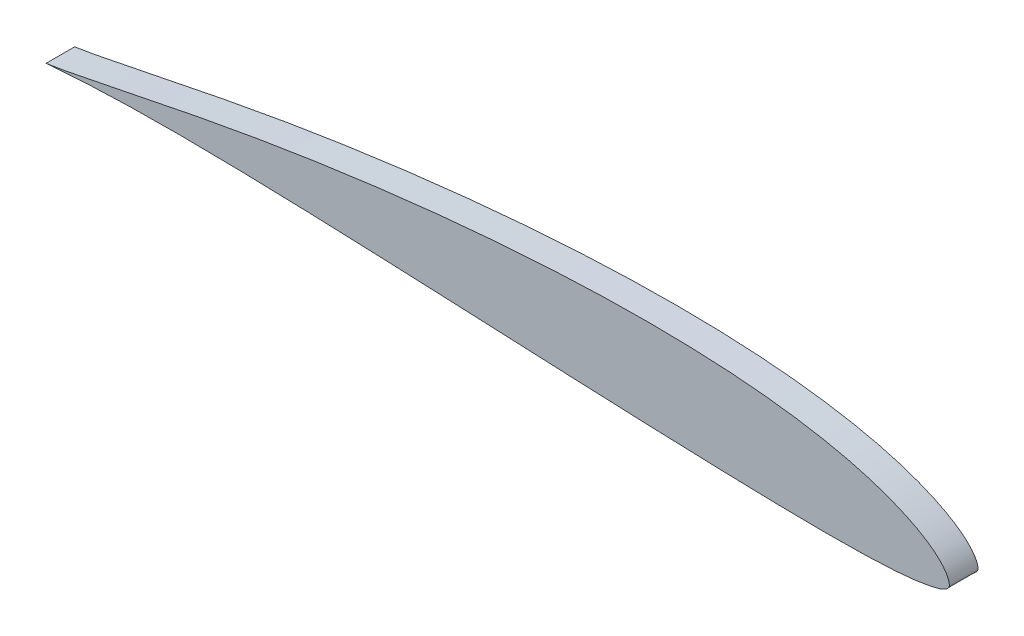
ISO-10303-21;
HEADER;
FILE_DESCRIPTION(('STEP AP214'),'2;1');
FILE_NAME('part.step','',(''),(''),'','','');
FILE_SCHEMA(('AUTOMOTIVE_DESIGN { 1 0 10303 214 1 1 1 1 }'));
ENDSEC;
DATA;
#1=APPLICATION_CONTEXT('core data for automotive mechanical design processes');
#2=APPLICATION_PROTOCOL_DEFINITION('international standard','automotive_design',2000,#1);
#3=PRODUCT_CONTEXT('',#1,'mechanical');
#4=PRODUCT('Part','Part','',(#3));
#5=PRODUCT_RELATED_PRODUCT_CATEGORY('part','',(#4));
#6=PRODUCT_DEFINITION_FORMATION('','',#4);
#7=PRODUCT_DEFINITION_CONTEXT('part definition',#1,'design');
#8=PRODUCT_DEFINITION('design','',#6,#7);
#9=PRODUCT_DEFINITION_SHAPE('','',#8);
#10=(LENGTH_UNIT() NAMED_UNIT(*) SI_UNIT(.MILLI.,.METRE.));
#11=(NAMED_UNIT(*) PLANE_ANGLE_UNIT() SI_UNIT($,.RADIAN.));
#12=(NAMED_UNIT(*) SI_UNIT($,.STERADIAN.) SOLID_ANGLE_UNIT());
#13=UNCERTAINTY_MEASURE_WITH_UNIT(LENGTH_MEASURE(1.E-05),#10,'distance_accuracy_value','');
#14=(GEOMETRIC_REPRESENTATION_CONTEXT(3) GLOBAL_UNCERTAINTY_ASSIGNED_CONTEXT((#13)) GLOBAL_UNIT_ASSIGNED_CONTEXT((#10,
#11,#12)) REPRESENTATION_CONTEXT('',''));
#15=CARTESIAN_POINT('',(0.,0.,0.));
#16=DIRECTION('',(0.,0.,1.));
#17=DIRECTION('',(1.,0.,0.));
#18=AXIS2_PLACEMENT_3D('',#15,#16,#17);
#19=CARTESIAN_POINT('',(2.3575779570362,55.8360552784786,6.35));
#20=DIRECTION('',(-0.0421856308777922,-0.999109790036832,0.));
#21=DIRECTION('',(0.999109790036832,-0.0421856308777922,0.));
#22=AXIS2_PLACEMENT_3D('',#19,#20,#21);
#23=PLANE('',#22);
#24=CARTESIAN_POINT('',(1754.97498737325,-18.165092384081,0.));
#25=DIRECTION('',(-0.0421856308777922,-0.999109790036832,0.));
#26=DIRECTION('',(0.999109790036832,-0.0421856308777922,0.));
#27=AXIS2_PLACEMENT_3D('',#24,#25,#26);
#28=ELLIPSE('',#27,3.17538763875182,3.17499999999999);
#29=CARTESIAN_POINT('',(1758.14754825028,-18.2990481149033,0.));
#30=VERTEX_POINT('',#29);
#31=EDGE_CURVE('E46',#30,#30,#28,.T.);
#32=ORIENTED_EDGE('',*,*,#31,.F.);
#33=EDGE_LOOP('',(#32));
#34=FACE_BOUND('',#33,.T.);
#35=DIRECTION('',(-0.999109790036832,0.0421856308777922,0.));
#36=VECTOR('',#35,1.);
#37=CARTESIAN_POINT('',(2.3575779570362,55.8360552784786,-6.35));
#38=LINE('',#37,#36);
#39=CARTESIAN_POINT('',(1767.6652308814,-18.7009153073702,-6.35));
#40=VERTEX_POINT('',#39);
#41=CARTESIAN_POINT('',(1742.28784221446,-17.6294002830741,-6.35));
#42=VERTEX_POINT('',#41);
#43=EDGE_CURVE('E151',#40,#42,#38,.T.);
#44=ORIENTED_EDGE('',*,*,#43,.F.);
#45=DIRECTION('',(0.,0.,-1.));
#46=VECTOR('',#45,1.);
#47=CARTESIAN_POINT('',(1767.6652308814,-18.7009153073702,6.35));
#48=LINE('',#47,#46);
#49=CARTESIAN_POINT('',(1767.6652308814,-18.7009153073702,6.35));
#50=VERTEX_POINT('',#49);
#51=EDGE_CURVE('E11',#50,#40,#48,.T.);
#52=ORIENTED_EDGE('',*,*,#51,.F.);
#53=DIRECTION('',(-0.999109790036832,0.0421856308777922,0.));
#54=VECTOR('',#53,1.);
#55=CARTESIAN_POINT('',(2.3575779570362,55.8360552784786,6.35));
#56=LINE('',#55,#54);
#57=CARTESIAN_POINT('',(1742.28784221446,-17.6294002830741,6.35));
#58=VERTEX_POINT('',#57);
#59=EDGE_CURVE('E112',#50,#58,#56,.T.);
#60=ORIENTED_EDGE('',*,*,#59,.T.);
#61=DIRECTION('',(0.,0.,-1.));
#62=VECTOR('',#61,1.);
#63=CARTESIAN_POINT('',(1742.28784221446,-17.6294002830741,6.35));
#64=LINE('',#63,#62);
#65=EDGE_CURVE('E83',#58,#42,#64,.T.);
#66=ORIENTED_EDGE('',*,*,#65,.T.);
#67=EDGE_LOOP('',(#44,#52,#60,#66));
#68=FACE_BOUND('',#67,.T.);
#69=ADVANCED_FACE('F43',(#34,#68),#23,.T.);
#70=CARTESIAN_POINT('',(1596.31021413288,-17.478209275154,6.35));
#71=CARTESIAN_POINT('',(1596.3102515309,-17.4900798795625,6.35));
#72=CARTESIAN_POINT('',(1599.1322423313,-17.2022330923903,6.35));
#73=CARTESIAN_POINT('',(1602.03182260984,-16.9907136810287,6.35));
#74=CARTESIAN_POINT('',(1609.10720109062,-16.4816305190965,6.35));
#75=CARTESIAN_POINT('',(1617.84346830049,-16.0122581327614,6.35));
#76=CARTESIAN_POINT('',(1629.29972086853,-15.5760026593076,6.35));
#77=CARTESIAN_POINT('',(1642.81673493414,-15.3091150572676,6.35));
#78=CARTESIAN_POINT('',(1658.33448053557,-15.2864051468592,6.35));
#79=CARTESIAN_POINT('',(1675.53154740055,-15.4897580032224,6.35));
#80=CARTESIAN_POINT('',(1694.16050142952,-15.9168759779006,6.35));
#81=CARTESIAN_POINT('',(1713.95156909246,-16.5363404784246,6.35));
#82=CARTESIAN_POINT('',(1734.64638447524,-17.3145316205594,6.35));
#83=CARTESIAN_POINT('',(1755.98575421537,-18.1841042418055,6.35));
#84=CARTESIAN_POINT('',(1777.70838338736,-19.1419446781197,6.35));
#85=CARTESIAN_POINT('',(1799.55769772036,-20.1293541585242,6.35));
#86=CARTESIAN_POINT('',(1821.2831429715,-21.1012838048597,6.35));
#87=CARTESIAN_POINT('',(1842.64516709738,-22.0116275533366,6.35));
#88=CARTESIAN_POINT('',(1863.40548202887,-22.8529134431896,6.35));
#89=CARTESIAN_POINT('',(1883.33023430574,-23.5822681473132,6.35));
#90=CARTESIAN_POINT('',(1902.18807730714,-24.1899386424968,6.35));
#91=CARTESIAN_POINT('',(1919.75949569216,-24.6424497284501,6.35));
#92=CARTESIAN_POINT('',(1935.8518352752,-24.8793410332257,6.35));
#93=CARTESIAN_POINT('',(1950.29422526534,-24.8739135013043,6.35));
#94=CARTESIAN_POINT('',(1962.94157873014,-24.6070759190933,6.35));
#95=CARTESIAN_POINT('',(1973.68021727723,-24.0183120574947,6.35));
#96=CARTESIAN_POINT('',(1982.39869388507,-23.1985552094744,6.35));
#97=CARTESIAN_POINT('',(1989.09296287627,-21.9114816071557,6.35));
#98=CARTESIAN_POINT('',(1993.57350987807,-20.7570563820821,6.35));
#99=CARTESIAN_POINT('',(1996.6806748032,-18.4574056102938,6.35));
#100=CARTESIAN_POINT('',(1995.81152486995,-15.0236569753175,6.35));
#101=CARTESIAN_POINT('',(1993.77484340238,-11.7907350557363,6.35));
#102=CARTESIAN_POINT('',(1990.03603736107,-8.11350883684481,6.35));
#103=CARTESIAN_POINT('',(1984.73373764165,-4.43183126644344,6.35));
#104=CARTESIAN_POINT('',(1977.84455466072,-0.738000891407876,6.35));
#105=CARTESIAN_POINT('',(1969.41765671903,2.8082946719217,6.35));
#106=CARTESIAN_POINT('',(1959.49253908317,6.11304090342494,6.35));
#107=CARTESIAN_POINT('',(1948.10296055372,9.02941444658797,6.35));
#108=CARTESIAN_POINT('',(1935.32435887673,11.5243026466393,6.35));
#109=CARTESIAN_POINT('',(1921.24125431776,13.586927955176,6.35));
#110=CARTESIAN_POINT('',(1905.94807917216,15.1257003058072,6.35));
#111=CARTESIAN_POINT('',(1889.56068995788,16.1513180356543,6.35));
#112=CARTESIAN_POINT('',(1872.20952379832,16.6653210663825,6.35));
#113=CARTESIAN_POINT('',(1854.04601062752,16.6739586592146,6.35));
#114=CARTESIAN_POINT('',(1835.23493639232,16.1998909506919,6.35));
#115=CARTESIAN_POINT('',(1815.95077146485,15.2635327555171,6.35));
#116=CARTESIAN_POINT('',(1796.37573706149,13.9033351938215,6.35));
#117=CARTESIAN_POINT('',(1776.70299506491,12.1582992439741,6.35));
#118=CARTESIAN_POINT('',(1757.13134712081,10.0744625588622,6.35));
#119=CARTESIAN_POINT('',(1737.85939642865,7.71225563047655,6.35));
#120=CARTESIAN_POINT('',(1719.08684801041,5.11473875154889,6.35));
#121=CARTESIAN_POINT('',(1701.00473801196,2.34073982283165,6.35));
#122=CARTESIAN_POINT('',(1683.79671044662,-0.560040691334636,6.35));
#123=CARTESIAN_POINT('',(1667.62831922199,-3.51396391232352,6.35));
#124=CARTESIAN_POINT('',(1652.66782034166,-6.42930574927058,6.35));
#125=CARTESIAN_POINT('',(1639.06708513807,-9.19163881630794,6.35));
#126=CARTESIAN_POINT('',(1627.05920043915,-11.6691543312357,6.35));
#127=CARTESIAN_POINT('',(1616.68795805122,-13.7848214634737,6.35));
#128=CARTESIAN_POINT('',(1608.59256465579,-15.3932547451612,6.35));
#129=CARTESIAN_POINT('',(1601.88092298677,-16.5823188951291,6.35));
#130=CARTESIAN_POINT('',(1599.08053019508,-17.0906211344314,6.35));
#131=CARTESIAN_POINT('',(1596.31017694321,-17.466404802761,6.35));
#132=CARTESIAN_POINT('',(1596.31021413288,-17.478209275154,6.35));
#133=B_SPLINE_CURVE_WITH_KNOTS('',3,(#70,#71,#72,#73,#74,#75,#76,#77,#78,#79,#80,#81,#82,#83,
#84,#85,#86,#87,#88,#89,#90,#91,#92,#93,#94,#95,#96,#97,#98,#99,#100,#101,#102,#103,#104,#105,
#106,#107,#108,#109,#110,#111,#112,#113,#114,#115,#116,#117,#118,#119,#120,#121,#122,#123,#124,
#125,#126,#127,#128,#129,#130,#131,#132),.UNSPECIFIED.,.T.,.F.,(4,1,1,1,1,1,1,1,1,1,1,1,1,1,1,1,
1,1,1,1,1,1,1,1,1,1,1,1,1,1,1,1,1,1,1,1,1,1,1,1,1,1,1,1,1,1,1,1,1,1,1,1,1,1,1,1,1,1,1,1,4),(0.,
0.00162827255922005,0.00649050965473852,0.0145193836673184,0.0256267718050507,
0.0396659782037578,0.0564158680126472,0.0755751983771271,0.0968144767188099,0.119812493963671,
0.1442464295869,0.169791911279109,0.196137839472828,0.222959252874957,0.249929689016993,
0.276747064878309,0.303109783270562,0.328732166600227,0.353323186514224,0.376592645275716,
0.398269788623994,0.418104249413604,0.435907310477593,0.451493631474574,0.464728190365783,
0.47551563303222,0.483813435244795,0.489622354181594,0.493000170515783,0.496319033276272,
0.50112136018567,0.507407277714504,0.515327375532837,0.52490812765617,0.536144750255862,
0.548990967810824,0.563425422459707,0.57944589810611,0.596955554448896,0.615864818248053,
0.636077717109341,0.657458391249912,0.679831384800272,0.703012205861105,0.726802900260427,
0.750982325596448,0.77532642647073,0.799588584319813,0.823519224580182,0.846883028826477,
0.869432574938011,0.890938901752127,0.911197778131604,0.930003617124546,0.947123678392186,
0.962312644452633,0.975299445140062,0.985817342446044,0.993591880191323,0.99838079866768,1.),.UNSPECIFIED.);
#134=DIRECTION('',(0.,0.,-1.));
#135=VECTOR('',#134,1.);
#136=SURFACE_OF_LINEAR_EXTRUSION('',#133,#135);
#137=CARTESIAN_POINT('',(1596.31021413288,-17.478209275154,-6.35));
#138=CARTESIAN_POINT('',(1596.3102515309,-17.4900798795625,-6.35));
#139=CARTESIAN_POINT('',(1599.1322423313,-17.2022330923903,-6.35));
#140=CARTESIAN_POINT('',(1602.03182260984,-16.9907136810287,-6.35));
#141=CARTESIAN_POINT('',(1609.10720109062,-16.4816305190965,-6.35));
#142=CARTESIAN_POINT('',(1617.84346830049,-16.0122581327614,-6.35));
#143=CARTESIAN_POINT('',(1629.29972086853,-15.5760026593076,-6.35));
#144=CARTESIAN_POINT('',(1642.81673493414,-15.3091150572676,-6.35));
#145=CARTESIAN_POINT('',(1658.33448053557,-15.2864051468592,-6.35));
#146=CARTESIAN_POINT('',(1675.53154740055,-15.4897580032224,-6.35));
#147=CARTESIAN_POINT('',(1694.16050142952,-15.9168759779006,-6.35));
#148=CARTESIAN_POINT('',(1713.95156909246,-16.5363404784246,-6.35));
#149=CARTESIAN_POINT('',(1734.64638447524,-17.3145316205594,-6.35));
#150=CARTESIAN_POINT('',(1755.98575421537,-18.1841042418055,-6.35));
#151=CARTESIAN_POINT('',(1777.70838338736,-19.1419446781197,-6.35));
#152=CARTESIAN_POINT('',(1799.55769772036,-20.1293541585242,-6.35));
#153=CARTESIAN_POINT('',(1821.2831429715,-21.1012838048597,-6.35));
#154=CARTESIAN_POINT('',(1842.64516709738,-22.0116275533366,-6.35));
#155=CARTESIAN_POINT('',(1863.40548202887,-22.8529134431896,-6.35));
#156=CARTESIAN_POINT('',(1883.33023430574,-23.5822681473132,-6.35));
#157=CARTESIAN_POINT('',(1902.18807730714,-24.1899386424968,-6.35));
#158=CARTESIAN_POINT('',(1919.75949569216,-24.6424497284501,-6.35));
#159=CARTESIAN_POINT('',(1935.8518352752,-24.8793410332257,-6.35));
#160=CARTESIAN_POINT('',(1950.29422526534,-24.8739135013043,-6.35));
#161=CARTESIAN_POINT('',(1962.94157873014,-24.6070759190933,-6.35));
#162=CARTESIAN_POINT('',(1973.68021727723,-24.0183120574947,-6.35));
#163=CARTESIAN_POINT('',(1982.39869388507,-23.1985552094744,-6.35));
#164=CARTESIAN_POINT('',(1989.09296287627,-21.9114816071557,-6.35));
#165=CARTESIAN_POINT('',(1993.57350987807,-20.7570563820821,-6.35));
#166=CARTESIAN_POINT('',(1996.6806748032,-18.4574056102938,-6.35));
#167=CARTESIAN_POINT('',(1995.81152486995,-15.0236569753175,-6.35));
#168=CARTESIAN_POINT('',(1993.77484340238,-11.7907350557363,-6.35));
#169=CARTESIAN_POINT('',(1990.03603736107,-8.11350883684481,-6.35));
#170=CARTESIAN_POINT('',(1984.73373764165,-4.43183126644344,-6.35));
#171=CARTESIAN_POINT('',(1977.84455466072,-0.738000891407876,-6.35));
#172=CARTESIAN_POINT('',(1969.41765671903,2.8082946719217,-6.35));
#173=CARTESIAN_POINT('',(1959.49253908317,6.11304090342494,-6.35));
#174=CARTESIAN_POINT('',(1948.10296055372,9.02941444658797,-6.35));
#175=CARTESIAN_POINT('',(1935.32435887673,11.5243026466393,-6.35));
#176=CARTESIAN_POINT('',(1921.24125431776,13.586927955176,-6.35));
#177=CARTESIAN_POINT('',(1905.94807917216,15.1257003058072,-6.35));
#178=CARTESIAN_POINT('',(1889.56068995788,16.1513180356543,-6.35));
#179=CARTESIAN_POINT('',(1872.20952379832,16.6653210663825,-6.35));
#180=CARTESIAN_POINT('',(1854.04601062752,16.6739586592146,-6.35));
#181=CARTESIAN_POINT('',(1835.23493639232,16.1998909506919,-6.35));
#182=CARTESIAN_POINT('',(1815.95077146485,15.2635327555171,-6.35));
#183=CARTESIAN_POINT('',(1796.37573706149,13.9033351938215,-6.35));
#184=CARTESIAN_POINT('',(1776.70299506491,12.1582992439741,-6.35));
#185=CARTESIAN_POINT('',(1757.13134712081,10.0744625588622,-6.35));
#186=CARTESIAN_POINT('',(1737.85939642865,7.71225563047655,-6.35));
#187=CARTESIAN_POINT('',(1719.08684801041,5.11473875154889,-6.35));
#188=CARTESIAN_POINT('',(1701.00473801196,2.34073982283165,-6.35));
#189=CARTESIAN_POINT('',(1683.79671044662,-0.560040691334636,-6.35));
#190=CARTESIAN_POINT('',(1667.62831922199,-3.51396391232352,-6.35));
#191=CARTESIAN_POINT('',(1652.66782034166,-6.42930574927058,-6.35));
#192=CARTESIAN_POINT('',(1639.06708513807,-9.19163881630794,-6.35));
#193=CARTESIAN_POINT('',(1627.05920043915,-11.6691543312357,-6.35));
#194=CARTESIAN_POINT('',(1616.68795805122,-13.7848214634737,-6.35));
#195=CARTESIAN_POINT('',(1608.59256465579,-15.3932547451612,-6.35));
#196=CARTESIAN_POINT('',(1601.88092298677,-16.5823188951291,-6.35));
#197=CARTESIAN_POINT('',(1599.08053019508,-17.0906211344314,-6.35));
#198=CARTESIAN_POINT('',(1596.31017694321,-17.466404802761,-6.35));
#199=CARTESIAN_POINT('',(1596.31021413288,-17.478209275154,-6.35));
#200=B_SPLINE_CURVE_WITH_KNOTS('',3,(#137,#138,#139,#140,#141,#142,#143,#144,#145,#146,#147,
#148,#149,#150,#151,#152,#153,#154,#155,#156,#157,#158,#159,#160,#161,#162,#163,#164,#165,#166,
#167,#168,#169,#170,#171,#172,#173,#174,#175,#176,#177,#178,#179,#180,#181,#182,#183,#184,#185,
#186,#187,#188,#189,#190,#191,#192,#193,#194,#195,#196,#197,#198,#199),.UNSPECIFIED.,.T.,.F.,(4,
1,1,1,1,1,1,1,1,1,1,1,1,1,1,1,1,1,1,1,1,1,1,1,1,1,1,1,1,1,1,1,1,1,1,1,1,1,1,1,1,1,1,1,1,1,1,1,1,
1,1,1,1,1,1,1,1,1,1,1,4),(0.,0.00162827255922005,0.00649050965473852,0.0145193836673184,
0.0256267718050507,0.0396659782037578,0.0564158680126472,0.0755751983771271,0.0968144767188099,
0.119812493963671,0.1442464295869,0.169791911279109,0.196137839472828,0.222959252874957,
0.249929689016993,0.276747064878309,0.303109783270562,0.328732166600227,0.353323186514224,
0.376592645275716,0.398269788623994,0.418104249413604,0.435907310477593,0.451493631474574,
0.464728190365783,0.47551563303222,0.483813435244795,0.489622354181594,0.493000170515783,
0.496319033276272,0.50112136018567,0.507407277714504,0.515327375532837,0.52490812765617,
0.536144750255862,0.548990967810824,0.563425422459707,0.57944589810611,0.596955554448896,
0.615864818248053,0.636077717109341,0.657458391249912,0.679831384800272,0.703012205861105,
0.726802900260427,0.750982325596448,0.77532642647073,0.799588584319813,0.823519224580182,
0.846883028826477,0.869432574938011,0.890938901752127,0.911197778131604,0.930003617124546,
0.947123678392186,0.962312644452633,0.975299445140062,0.985817342446044,0.993591880191323,
0.99838079866768,1.),.UNSPECIFIED.);
#201=CARTESIAN_POINT('',(1894.67419788151,-23.9426877498647,-6.35));
#202=VERTEX_POINT('',#201);
#203=EDGE_CURVE('E154',#40,#202,#200,.T.);
#204=ORIENTED_EDGE('',*,*,#203,.T.);
#205=DIRECTION('',(0.,0.,-1.));
#206=VECTOR('',#205,1.);
#207=CARTESIAN_POINT('',(1894.67419788151,-23.9426877498647,6.35));
#208=LINE('',#207,#206);
#209=CARTESIAN_POINT('',(1894.67419788151,-23.9426877498647,6.35));
#210=VERTEX_POINT('',#209);
#211=EDGE_CURVE('E52',#210,#202,#208,.T.);
#212=ORIENTED_EDGE('',*,*,#211,.F.);
#213=EDGE_CURVE('E114',#50,#210,#133,.T.);
#214=ORIENTED_EDGE('',*,*,#213,.F.);
#215=ORIENTED_EDGE('',*,*,#51,.T.);
#216=EDGE_LOOP('',(#204,#212,#214,#215));
#217=FACE_BOUND('',#216,.T.);
#218=ADVANCED_FACE('F131',(#217),#136,.F.);
#219=CARTESIAN_POINT('',(0.701602531150922,26.3969899564991,6.35));
#220=DIRECTION('',(-0.0265695007087187,-0.999646968500425,0.));
#221=DIRECTION('',(0.999646968500425,-0.0265695007087187,0.));
#222=AXIS2_PLACEMENT_3D('',#219,#220,#221);
#223=PLANE('',#222);
#224=CARTESIAN_POINT('',(1907.36971438147,-24.2801204088655,0.));
#225=DIRECTION('',(-0.0265695007087187,-0.999646968500425,0.));
#226=DIRECTION('',(0.999646968500425,-0.0265695007087187,0.));
#227=AXIS2_PLACEMENT_3D('',#224,#225,#226);
#228=CIRCLE('',#227,3.17499999999999);
#229=CARTESIAN_POINT('',(1910.54359350645,-24.3644785736157,0.));
#230=VERTEX_POINT('',#229);
#231=EDGE_CURVE('E105',#230,#230,#228,.T.);
#232=ORIENTED_EDGE('',*,*,#231,.F.);
#233=EDGE_LOOP('',(#232));
#234=FACE_BOUND('',#233,.T.);
#235=DIRECTION('',(-0.999646968500425,0.0265695007087187,0.));
#236=VECTOR('',#235,1.);
#237=CARTESIAN_POINT('',(0.701602531150922,26.3969899564991,-6.35));
#238=LINE('',#237,#236);
#239=CARTESIAN_POINT('',(1920.06523088142,-24.6175530678662,-6.35));
#240=VERTEX_POINT('',#239);
#241=EDGE_CURVE('E156',#240,#202,#238,.T.);
#242=ORIENTED_EDGE('',*,*,#241,.F.);
#243=DIRECTION('',(0.,0.,-1.));
#244=VECTOR('',#243,1.);
#245=CARTESIAN_POINT('',(1920.06523088142,-24.6175530678662,6.35));
#246=LINE('',#245,#244);
#247=CARTESIAN_POINT('',(1920.06523088142,-24.6175530678662,6.35));
#248=VERTEX_POINT('',#247);
#249=EDGE_CURVE('E76',#248,#240,#246,.T.);
#250=ORIENTED_EDGE('',*,*,#249,.F.);
#251=DIRECTION('',(-0.999646968500425,0.0265695007087187,0.));
#252=VECTOR('',#251,1.);
#253=CARTESIAN_POINT('',(0.701602531150922,26.3969899564991,6.35));
#254=LINE('',#253,#252);
#255=EDGE_CURVE('E120',#248,#210,#254,.T.);
#256=ORIENTED_EDGE('',*,*,#255,.T.);
#257=ORIENTED_EDGE('',*,*,#211,.T.);
#258=EDGE_LOOP('',(#242,#250,#256,#257));
#259=FACE_BOUND('',#258,.T.);
#260=ADVANCED_FACE('F130',(#234,#259),#223,.T.);
#261=EDGE_CURVE('E115',#240,#42,#200,.T.);
#262=ORIENTED_EDGE('',*,*,#261,.T.);
#263=ORIENTED_EDGE('',*,*,#65,.F.);
#264=EDGE_CURVE('E60',#248,#58,#133,.T.);
#265=ORIENTED_EDGE('',*,*,#264,.F.);
#266=ORIENTED_EDGE('',*,*,#249,.T.);
#267=EDGE_LOOP('',(#262,#263,#265,#266));
#268=FACE_BOUND('',#267,.T.);
#269=ADVANCED_FACE('F126',(#268),#136,.F.);
#270=CARTESIAN_POINT('',(0.,0.,6.35));
#271=DIRECTION('',(0.,0.,1.));
#272=DIRECTION('',(1.,0.,0.));
#273=AXIS2_PLACEMENT_3D('',#270,#271,#272);
#274=PLANE('',#273);
#275=ORIENTED_EDGE('',*,*,#59,.F.);
#276=ORIENTED_EDGE('',*,*,#213,.T.);
#277=ORIENTED_EDGE('',*,*,#255,.F.);
#278=ORIENTED_EDGE('',*,*,#264,.T.);
#279=EDGE_LOOP('',(#275,#276,#277,#278));
#280=FACE_BOUND('',#279,.T.);
#281=ADVANCED_FACE('F129',(#280),#274,.T.);
#282=CARTESIAN_POINT('',(0.,0.,-6.35));
#283=DIRECTION('',(0.,0.,1.));
#284=DIRECTION('',(1.,0.,0.));
#285=AXIS2_PLACEMENT_3D('',#282,#283,#284);
#286=PLANE('',#285);
#287=ORIENTED_EDGE('',*,*,#43,.T.);
#288=ORIENTED_EDGE('',*,*,#261,.F.);
#289=ORIENTED_EDGE('',*,*,#241,.T.);
#290=ORIENTED_EDGE('',*,*,#203,.F.);
#291=EDGE_LOOP('',(#287,#288,#289,#290));
#292=FACE_BOUND('',#291,.T.);
#293=ADVANCED_FACE('F132',(#292),#286,.F.);
#294=CARTESIAN_POINT('',(1755.25758543384,-7.53266471158802,0.));
#295=DIRECTION('',(-0.0265695007087187,-0.999646968500425,0.));
#296=DIRECTION('',(0.999646968500425,-0.0265695007087187,0.));
#297=AXIS2_PLACEMENT_3D('',#294,#295,#296);
#298=CONICAL_SURFACE('',#297,3.17499999999999,1.02974425867665);
#299=CARTESIAN_POINT('',(1755.30827293293,-5.62560573582858,0.));
#300=VERTEX_POINT('',#299);
#301=VERTEX_LOOP('',#300);
#302=FACE_BOUND('',#301,.T.);
#303=CARTESIAN_POINT('',(1755.25758543384,-7.53266471158802,0.));
#304=DIRECTION('',(-0.0265695007087187,-0.999646968500425,0.));
#305=DIRECTION('',(0.999646968500425,-0.0265695007087187,0.));
#306=AXIS2_PLACEMENT_3D('',#303,#304,#305);
#307=CIRCLE('',#306,3.17499999999999);
#308=CARTESIAN_POINT('',(1758.43146455883,-7.61702287633821,0.));
#309=VERTEX_POINT('',#308);
#310=EDGE_CURVE('E104',#309,#309,#307,.T.);
#311=ORIENTED_EDGE('',*,*,#310,.T.);
#312=EDGE_LOOP('',(#311));
#313=FACE_BOUND('',#312,.T.);
#314=ADVANCED_FACE('F174',(#302,#313),#298,.F.);
#315=CARTESIAN_POINT('',(1754.92015277484,-20.2281812115434,0.));
#316=DIRECTION('',(-0.0265695007087187,-0.999646968500425,0.));
#317=DIRECTION('',(0.999646968500425,-0.0265695007087187,0.));
#318=AXIS2_PLACEMENT_3D('',#315,#316,#317);
#319=CYLINDRICAL_SURFACE('',#318,3.17499999999999);
#320=ORIENTED_EDGE('',*,*,#31,.T.);
#321=EDGE_LOOP('',(#320));
#322=FACE_BOUND('',#321,.T.);
#323=ORIENTED_EDGE('',*,*,#310,.F.);
#324=EDGE_LOOP('',(#323));
#325=FACE_BOUND('',#324,.T.);
#326=ADVANCED_FACE('F98',(#322,#325),#319,.F.);
#327=CARTESIAN_POINT('',(1907.70714704047,-11.5846039089101,0.));
#328=DIRECTION('',(-0.0265695007087187,-0.999646968500425,0.));
#329=DIRECTION('',(0.999646968500425,-0.0265695007087187,0.));
#330=AXIS2_PLACEMENT_3D('',#327,#328,#329);
#331=CONICAL_SURFACE('',#330,3.17499999999999,1.02974425867665);
#332=CARTESIAN_POINT('',(1907.75783453956,-9.67754493315065,0.));
#333=VERTEX_POINT('',#332);
#334=VERTEX_LOOP('',#333);
#335=FACE_BOUND('',#334,.T.);
#336=CARTESIAN_POINT('',(1907.70714704047,-11.5846039089101,0.));
#337=DIRECTION('',(-0.0265695007087187,-0.999646968500425,0.));
#338=DIRECTION('',(0.999646968500425,-0.0265695007087187,0.));
#339=AXIS2_PLACEMENT_3D('',#336,#337,#338);
#340=CIRCLE('',#339,3.17499999999999);
#341=CARTESIAN_POINT('',(1910.88102616546,-11.6689620736603,0.));
#342=VERTEX_POINT('',#341);
#343=EDGE_CURVE('E102',#342,#342,#340,.T.);
#344=ORIENTED_EDGE('',*,*,#343,.T.);
#345=EDGE_LOOP('',(#344));
#346=FACE_BOUND('',#345,.T.);
#347=ADVANCED_FACE('F94',(#335,#346),#331,.F.);
#348=CARTESIAN_POINT('',(1907.36971438147,-24.2801204088655,0.));
#349=DIRECTION('',(-0.0265695007087187,-0.999646968500425,0.));
#350=DIRECTION('',(0.999646968500425,-0.0265695007087187,0.));
#351=AXIS2_PLACEMENT_3D('',#348,#349,#350);
#352=CYLINDRICAL_SURFACE('',#351,3.17499999999999);
#353=ORIENTED_EDGE('',*,*,#343,.F.);
#354=EDGE_LOOP('',(#353));
#355=FACE_BOUND('',#354,.T.);
#356=ORIENTED_EDGE('',*,*,#231,.T.);
#357=EDGE_LOOP('',(#356));
#358=FACE_BOUND('',#357,.T.);
#359=ADVANCED_FACE('F97',(#355,#358),#352,.F.);
#360=CLOSED_SHELL('',(#69,#218,#260,#269,#281,#293,#314,#326,#347,#359));
#361=MANIFOLD_SOLID_BREP('B2',#360);
#362=ADVANCED_BREP_SHAPE_REPRESENTATION('',(#18,#361),#14);
#363=SHAPE_DEFINITION_REPRESENTATION(#9,#362);
ENDSEC;
END-ISO-10303-21;
